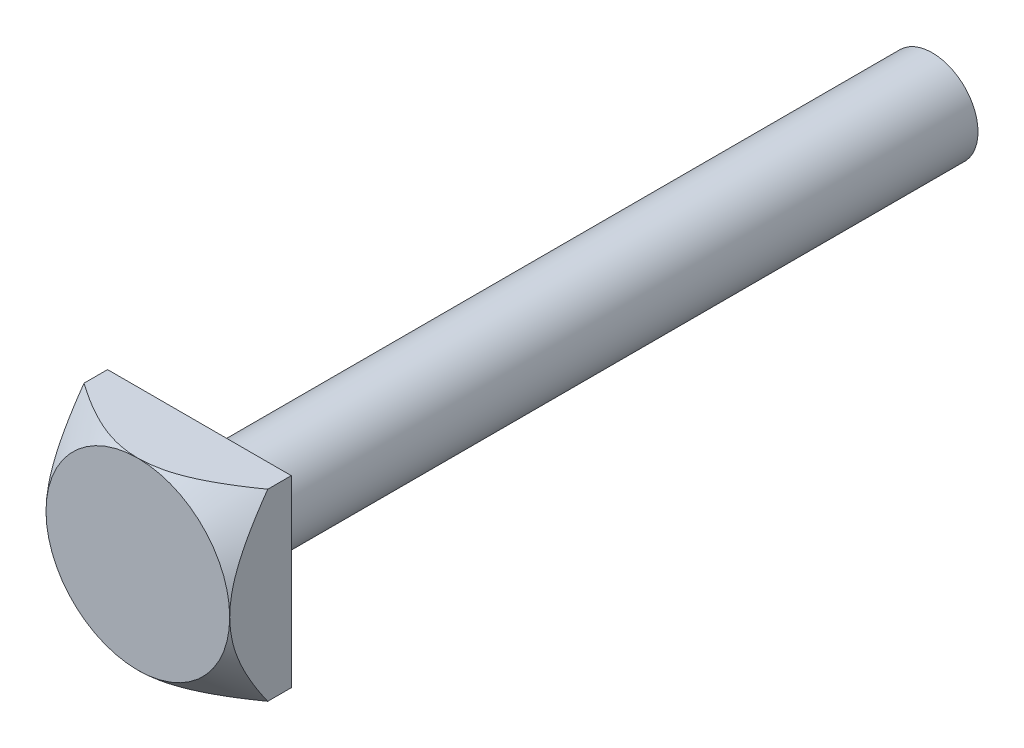
ISO-10303-21;
HEADER;
FILE_DESCRIPTION(('STEP AP214'),'2;1');
FILE_NAME('part.step','',(''),(''),'','','');
FILE_SCHEMA(('AUTOMOTIVE_DESIGN { 1 0 10303 214 1 1 1 1 }'));
ENDSEC;
DATA;
#1=APPLICATION_CONTEXT('core data for automotive mechanical design processes');
#2=APPLICATION_PROTOCOL_DEFINITION('international standard','automotive_design',2000,#1);
#3=PRODUCT_CONTEXT('',#1,'mechanical');
#4=PRODUCT('Part','Part','',(#3));
#5=PRODUCT_RELATED_PRODUCT_CATEGORY('part','',(#4));
#6=PRODUCT_DEFINITION_FORMATION('','',#4);
#7=PRODUCT_DEFINITION_CONTEXT('part definition',#1,'design');
#8=PRODUCT_DEFINITION('design','',#6,#7);
#9=PRODUCT_DEFINITION_SHAPE('','',#8);
#10=(LENGTH_UNIT() NAMED_UNIT(*) SI_UNIT(.MILLI.,.METRE.));
#11=(NAMED_UNIT(*) PLANE_ANGLE_UNIT() SI_UNIT($,.RADIAN.));
#12=(NAMED_UNIT(*) SI_UNIT($,.STERADIAN.) SOLID_ANGLE_UNIT());
#13=UNCERTAINTY_MEASURE_WITH_UNIT(LENGTH_MEASURE(1.E-05),#10,'distance_accuracy_value','');
#14=(GEOMETRIC_REPRESENTATION_CONTEXT(3) GLOBAL_UNCERTAINTY_ASSIGNED_CONTEXT((#13)) GLOBAL_UNIT_ASSIGNED_CONTEXT((#10,
#11,#12)) REPRESENTATION_CONTEXT('',''));
#15=CARTESIAN_POINT('',(0.,0.,0.));
#16=DIRECTION('',(0.,0.,1.));
#17=DIRECTION('',(1.,0.,0.));
#18=AXIS2_PLACEMENT_3D('',#15,#16,#17);
#19=CARTESIAN_POINT('',(9.55,9.55,-6.4));
#20=DIRECTION('',(1.,0.,0.));
#21=DIRECTION('',(0.,0.,-1.));
#22=AXIS2_PLACEMENT_3D('',#19,#20,#21);
#23=PLANE('',#22);
#24=DIRECTION('',(0.,0.,1.));
#25=VECTOR('',#24,1.);
#26=CARTESIAN_POINT('',(9.55,9.55,-6.4));
#27=LINE('',#26,#25);
#28=CARTESIAN_POINT('',(9.55,9.55,-6.4));
#29=VERTEX_POINT('',#28);
#30=CARTESIAN_POINT('',(9.55,9.55,-3.95573952066304));
#31=VERTEX_POINT('',#30);
#32=EDGE_CURVE('E197',#29,#31,#27,.T.);
#33=ORIENTED_EDGE('',*,*,#32,.T.);
#34=CARTESIAN_POINT('',(9.55,29.693933516903,-21.6418609208596));
#35=CARTESIAN_POINT('',(9.55,29.1764652059459,-21.1492594453645));
#36=CARTESIAN_POINT('',(9.55,28.6584091582842,-20.657273895499));
#37=CARTESIAN_POINT('',(9.55,27.6208891459155,-19.6747832589286));
#38=CARTESIAN_POINT('',(9.55,27.1014251723575,-19.184278181572));
#39=CARTESIAN_POINT('',(9.55,26.0606659594791,-18.2048175232453));
#40=CARTESIAN_POINT('',(9.55,25.5393701000784,-17.7158626008558));
#41=CARTESIAN_POINT('',(9.55,24.4948461233191,-16.7400221653327));
#42=CARTESIAN_POINT('',(9.55,23.9716180097625,-16.2531366481311));
#43=CARTESIAN_POINT('',(9.55,22.9169648331294,-15.2763922427827));
#44=CARTESIAN_POINT('',(9.55,22.3855137393102,-14.7865614449679));
#45=CARTESIAN_POINT('',(9.55,21.3197711379315,-13.8099995023414));
#46=CARTESIAN_POINT('',(9.55,20.7854796367506,-13.3232683505744));
#47=CARTESIAN_POINT('',(9.55,19.7135665079601,-12.353765256381));
#48=CARTESIAN_POINT('',(9.55,19.1759457839259,-11.8709923157949));
#49=CARTESIAN_POINT('',(9.55,18.0964206731338,-10.9102600688774));
#50=CARTESIAN_POINT('',(9.55,17.5545163221987,-10.4323007223671));
#51=CARTESIAN_POINT('',(9.55,16.6097636496984,-9.60850871811011));
#52=CARTESIAN_POINT('',(9.55,16.2081549653106,-9.26125520341849));
#53=CARTESIAN_POINT('',(9.55,15.4014597404489,-8.57081408393836));
#54=CARTESIAN_POINT('',(9.55,14.9963732348358,-8.22762643847658));
#55=CARTESIAN_POINT('',(9.55,14.1817270482036,-7.54602459020928));
#56=CARTESIAN_POINT('',(9.55,13.7721645051468,-7.20761380217907));
#57=CARTESIAN_POINT('',(9.55,12.9479334714,-6.53707581236166));
#58=CARTESIAN_POINT('',(9.55,12.5332651073607,-6.20494845522929));
#59=CARTESIAN_POINT('',(9.55,11.6985598258369,-5.54940844216005));
#60=CARTESIAN_POINT('',(9.55,11.2785368448964,-5.2259781018549));
#61=CARTESIAN_POINT('',(9.55,10.4306625755023,-4.58940430025183));
#62=CARTESIAN_POINT('',(9.55,10.0028103357711,-4.27626210208894));
#63=CARTESIAN_POINT('',(9.55,9.13783115554924,-3.66397009190129));
#64=CARTESIAN_POINT('',(9.55,8.70071503391426,-3.36480513833686));
#65=CARTESIAN_POINT('',(9.55,8.03597104038228,-2.9300407641074));
#66=CARTESIAN_POINT('',(9.55,7.81290258742787,-2.78746441862855));
#67=CARTESIAN_POINT('',(9.55,7.36335861643196,-2.50779955071699));
#68=CARTESIAN_POINT('',(9.55,7.13688332441567,-2.37071066641102));
#69=CARTESIAN_POINT('',(9.55,6.73809475908612,-2.13697452151889));
#70=CARTESIAN_POINT('',(9.55,6.56662285651103,-2.03889339866205));
#71=CARTESIAN_POINT('',(9.55,6.22140236384468,-1.84683236833783));
#72=CARTESIAN_POINT('',(9.55,6.04765378061369,-1.75285244851608));
#73=CARTESIAN_POINT('',(9.55,5.52265266088263,-1.47783524093098));
#74=CARTESIAN_POINT('',(9.55,5.16769336730424,-1.30374935938001));
#75=CARTESIAN_POINT('',(9.55,4.44801939046082,-0.980168207494644));
#76=CARTESIAN_POINT('',(9.55,4.08334027206714,-0.830594641441941));
#77=CARTESIAN_POINT('',(9.55,3.34276937216537,-0.562260312048987));
#78=CARTESIAN_POINT('',(9.55,2.96688354418923,-0.443483502134283));
#79=CARTESIAN_POINT('',(9.55,2.30963833658963,-0.271699860119243));
#80=CARTESIAN_POINT('',(9.55,2.03066435154689,-0.209588983086116));
#81=CARTESIAN_POINT('',(9.55,1.46855787870733,-0.108303698297078));
#82=CARTESIAN_POINT('',(9.55,1.18542608380549,-0.0691255123137094));
#83=CARTESIAN_POINT('',(9.55,0.617321995943938,-0.0157617749065207));
#84=CARTESIAN_POINT('',(9.55,0.332354174170014,-0.00152928732844366));
#85=CARTESIAN_POINT('',(9.55,-0.23771847170053,0.00129484069400304));
#86=CARTESIAN_POINT('',(9.55,-0.522823298855705,-0.0101141206771392));
#87=CARTESIAN_POINT('',(9.55,-1.09007005805814,-0.057865025580449));
#88=CARTESIAN_POINT('',(9.55,-1.37221818459153,-0.0941345709152556));
#89=CARTESIAN_POINT('',(9.55,-1.93256124003416,-0.189661936364987));
#90=CARTESIAN_POINT('',(9.55,-2.21075585194957,-0.248921589172384));
#91=CARTESIAN_POINT('',(9.55,-2.76273693122464,-0.38798874577813));
#92=CARTESIAN_POINT('',(9.55,-3.03650866966306,-0.467854012668833));
#93=CARTESIAN_POINT('',(9.55,-3.57822754307582,-0.64513030777742));
#94=CARTESIAN_POINT('',(9.55,-3.84617495809548,-0.742540490299408));
#95=CARTESIAN_POINT('',(9.55,-4.4770897560131,-0.992000236476463));
#96=CARTESIAN_POINT('',(9.55,-4.83740434594086,-1.150734436302));
#97=CARTESIAN_POINT('',(9.55,-5.54769800146413,-1.49001878624924));
#98=CARTESIAN_POINT('',(9.55,-5.8976710318953,-1.67058137393872));
#99=CARTESIAN_POINT('',(9.55,-6.58908584017521,-2.04890803548533));
#100=CARTESIAN_POINT('',(9.55,-6.93050795637214,-2.24670776903849));
#101=CARTESIAN_POINT('',(9.55,-7.60530010201944,-2.65536955539214));
#102=CARTESIAN_POINT('',(9.55,-7.93867162572103,-2.86622915787577));
#103=CARTESIAN_POINT('',(9.55,-8.60297315768565,-3.30106199288578));
#104=CARTESIAN_POINT('',(9.55,-8.9338140039917,-3.5251708067635));
#105=CARTESIAN_POINT('',(9.55,-9.58965852614634,-3.98176502906057));
#106=CARTESIAN_POINT('',(9.55,-9.91466199621162,-4.2142507319228));
#107=CARTESIAN_POINT('',(9.55,-10.5593261690057,-4.68564554047618));
#108=CARTESIAN_POINT('',(9.55,-10.8789931636697,-4.92454606558313));
#109=CARTESIAN_POINT('',(9.55,-11.5141571994954,-5.40780319816399));
#110=CARTESIAN_POINT('',(9.55,-11.8296543144106,-5.65215970893086));
#111=CARTESIAN_POINT('',(9.55,-12.5419636094729,-6.21206127184567));
#112=CARTESIAN_POINT('',(9.55,-12.9376903036899,-6.52898578583347));
#113=CARTESIAN_POINT('',(9.55,-13.724472938816,-7.16858956311645));
#114=CARTESIAN_POINT('',(9.55,-14.1155287367368,-7.4912690018348));
#115=CARTESIAN_POINT('',(9.55,-14.8938019571623,-8.14129881729552));
#116=CARTESIAN_POINT('',(9.55,-15.2810189785957,-8.46864967356554));
#117=CARTESIAN_POINT('',(9.55,-16.0522148536554,-9.12714766599574));
#118=CARTESIAN_POINT('',(9.55,-16.4361936704089,-9.45829484528265));
#119=CARTESIAN_POINT('',(9.55,-17.201799649334,-10.1240602347691));
#120=CARTESIAN_POINT('',(9.55,-17.583424088608,-10.4586815733742));
#121=CARTESIAN_POINT('',(9.55,-18.3443447774176,-11.1305624069584));
#122=CARTESIAN_POINT('',(9.55,-18.7236410149389,-11.4678219155308));
#123=CARTESIAN_POINT('',(9.55,-19.8585035528912,-12.4828785598069));
#124=CARTESIAN_POINT('',(9.55,-20.6110966889252,-13.1640001215344));
#125=CARTESIAN_POINT('',(9.55,-22.0635693241208,-14.4900018900595));
#126=CARTESIAN_POINT('',(9.55,-22.7638071108822,-15.1344906924876));
#127=CARTESIAN_POINT('',(9.55,-24.1602268106212,-16.4278716631752));
#128=CARTESIAN_POINT('',(9.55,-24.8564086456588,-17.076763915537));
#129=CARTESIAN_POINT('',(9.55,-26.2442999872694,-18.3768099647415));
#130=CARTESIAN_POINT('',(9.55,-26.9360152933752,-19.0279575767548));
#131=CARTESIAN_POINT('',(9.55,-28.3168032181963,-20.3330033576064));
#132=CARTESIAN_POINT('',(9.55,-29.0058759247212,-20.9869014335102));
#133=CARTESIAN_POINT('',(9.55,-29.693933516903,-21.6418609208596));
#134=B_SPLINE_CURVE_WITH_KNOTS('',3,(#34,#35,#36,#37,#38,#39,#40,#41,#42,#43,#44,#45,#46,#47,
#48,#49,#50,#51,#52,#53,#54,#55,#56,#57,#58,#59,#60,#61,#62,#63,#64,#65,#66,#67,#68,#69,#70,#71,
#72,#73,#74,#75,#76,#77,#78,#79,#80,#81,#82,#83,#84,#85,#86,#87,#88,#89,#90,#91,#92,#93,#94,#95,
#96,#97,#98,#99,#100,#101,#102,#103,#104,#105,#106,#107,#108,#109,#110,#111,#112,#113,#114,#115,
#116,#117,#118,#119,#120,#121,#122,#123,#124,#125,#126,#127,#128,#129,#130,#131,#132,#133),
.UNSPECIFIED.,.F.,.F.,(4,2,2,2,2,2,2,2,2,2,2,2,2,2,2,2,2,2,2,2,2,2,2,2,2,2,2,2,2,2,2,2,2,2,2,2,
2,2,2,2,2,2,2,2,2,2,2,2,2,4),(0.,2.14333183250438,4.28667717060929,6.43083580142928,
8.57499021546774,10.7432446759854,12.911494269429,15.0791791418796,17.2468459056792,
18.8395802520007,20.4322986517901,22.0261031830036,23.619868258983,25.2101007695557,
26.8005277980995,28.3891899533633,29.1833499822353,29.9774575532737,30.5700283036289,
31.1625972688127,32.3479046066284,33.5293488309213,34.7101762238716,35.5667629100355,
36.4232084313045,37.2780407852267,38.1328932026307,38.9852666642973,39.8377080882178,
40.6925656023141,41.5473819217915,42.7275688366482,43.9084314064603,45.091797697039,
46.2749426308933,47.4735833984073,48.672266338641,49.869418769571,51.0665499978579,
52.5874544245123,54.1084052912917,55.6295134252481,57.1506388563454,58.6732791996949,
60.1959273937673,63.2410126328629,66.0960382879751,68.9511186260953,71.8010525947044,
74.6508910290299),.UNSPECIFIED.);
#135=CARTESIAN_POINT('',(9.55,0.,0.));
#136=VERTEX_POINT('',#135);
#137=EDGE_CURVE('E85',#31,#136,#134,.T.);
#138=ORIENTED_EDGE('',*,*,#137,.T.);
#139=CARTESIAN_POINT('',(9.55,-9.55,-3.95573952066304));
#140=VERTEX_POINT('',#139);
#141=EDGE_CURVE('E171',#136,#140,#134,.T.);
#142=ORIENTED_EDGE('',*,*,#141,.T.);
#143=DIRECTION('',(0.,0.,1.));
#144=VECTOR('',#143,1.);
#145=CARTESIAN_POINT('',(9.55,-9.55,-6.4));
#146=LINE('',#145,#144);
#147=CARTESIAN_POINT('',(9.55,-9.55,-6.4));
#148=VERTEX_POINT('',#147);
#149=EDGE_CURVE('E210',#148,#140,#146,.T.);
#150=ORIENTED_EDGE('',*,*,#149,.F.);
#151=DIRECTION('',(0.,1.,0.));
#152=VECTOR('',#151,1.);
#153=CARTESIAN_POINT('',(9.55,9.55,-6.4));
#154=LINE('',#153,#152);
#155=EDGE_CURVE('E200',#148,#29,#154,.T.);
#156=ORIENTED_EDGE('',*,*,#155,.T.);
#157=EDGE_LOOP('',(#33,#138,#142,#150,#156));
#158=FACE_BOUND('',#157,.T.);
#159=ADVANCED_FACE('F65',(#158),#23,.T.);
#160=CARTESIAN_POINT('',(-9.55,-9.55,-6.4));
#161=DIRECTION('',(0.,-1.,0.));
#162=DIRECTION('',(0.,0.,-1.));
#163=AXIS2_PLACEMENT_3D('',#160,#161,#162);
#164=PLANE('',#163);
#165=ORIENTED_EDGE('',*,*,#149,.T.);
#166=CARTESIAN_POINT('',(29.693933516903,-9.55,-21.6418609208596));
#167=CARTESIAN_POINT('',(29.1764652059459,-9.55,-21.1492594453645));
#168=CARTESIAN_POINT('',(28.6584091582842,-9.55,-20.657273895499));
#169=CARTESIAN_POINT('',(27.6208891459155,-9.55,-19.6747832589286));
#170=CARTESIAN_POINT('',(27.1014251723575,-9.55,-19.184278181572));
#171=CARTESIAN_POINT('',(26.0606659594791,-9.55,-18.2048175232453));
#172=CARTESIAN_POINT('',(25.5393701000784,-9.55,-17.7158626008558));
#173=CARTESIAN_POINT('',(24.4948461233191,-9.55,-16.7400221653327));
#174=CARTESIAN_POINT('',(23.9716180097625,-9.55,-16.2531366481311));
#175=CARTESIAN_POINT('',(22.9169648331294,-9.55,-15.2763922427827));
#176=CARTESIAN_POINT('',(22.3855137393102,-9.55,-14.7865614449679));
#177=CARTESIAN_POINT('',(21.3197711379315,-9.55,-13.8099995023414));
#178=CARTESIAN_POINT('',(20.7854796367505,-9.55,-13.3232683505744));
#179=CARTESIAN_POINT('',(19.7135665079601,-9.55,-12.353765256381));
#180=CARTESIAN_POINT('',(19.1759457839259,-9.55,-11.8709923157949));
#181=CARTESIAN_POINT('',(18.0964206731338,-9.55,-10.9102600688774));
#182=CARTESIAN_POINT('',(17.5545163221987,-9.55,-10.4323007223671));
#183=CARTESIAN_POINT('',(16.6097636496984,-9.55,-9.6085087181101));
#184=CARTESIAN_POINT('',(16.2081549653106,-9.55,-9.26125520341849));
#185=CARTESIAN_POINT('',(15.4014597404489,-9.55,-8.57081408393836));
#186=CARTESIAN_POINT('',(14.9963732348358,-9.55,-8.22762643847657));
#187=CARTESIAN_POINT('',(14.1817270482036,-9.55,-7.54602459020928));
#188=CARTESIAN_POINT('',(13.7721645051468,-9.55,-7.20761380217908));
#189=CARTESIAN_POINT('',(12.9479334714,-9.55,-6.53707581236167));
#190=CARTESIAN_POINT('',(12.5332651073607,-9.55,-6.2049484552293));
#191=CARTESIAN_POINT('',(11.6985598258369,-9.55,-5.54940844216006));
#192=CARTESIAN_POINT('',(11.2785368448964,-9.55,-5.22597810185491));
#193=CARTESIAN_POINT('',(10.4306625755024,-9.55,-4.58940430025184));
#194=CARTESIAN_POINT('',(10.0028103357711,-9.55,-4.27626210208896));
#195=CARTESIAN_POINT('',(9.13783115554927,-9.55,-3.6639700919013));
#196=CARTESIAN_POINT('',(8.70071503391429,-9.55,-3.36480513833688));
#197=CARTESIAN_POINT('',(8.03597104038232,-9.55,-2.93004076410742));
#198=CARTESIAN_POINT('',(7.81290258742791,-9.55,-2.78746441862857));
#199=CARTESIAN_POINT('',(7.36335861643199,-9.55,-2.50779955071701));
#200=CARTESIAN_POINT('',(7.13688332441571,-9.55,-2.37071066641104));
#201=CARTESIAN_POINT('',(6.73809475908616,-9.55,-2.13697452151891));
#202=CARTESIAN_POINT('',(6.56662285651107,-9.55,-2.03889339866207));
#203=CARTESIAN_POINT('',(6.22140236384472,-9.55,-1.84683236833785));
#204=CARTESIAN_POINT('',(6.04765378061374,-9.55,-1.7528524485161));
#205=CARTESIAN_POINT('',(5.52265266088268,-9.55,-1.477835240931));
#206=CARTESIAN_POINT('',(5.16769336730429,-9.55,-1.30374935938003));
#207=CARTESIAN_POINT('',(4.44801939046086,-9.55,-0.980168207494664));
#208=CARTESIAN_POINT('',(4.08334027206719,-9.55,-0.830594641441959));
#209=CARTESIAN_POINT('',(3.34276937216542,-9.55,-0.562260312049002));
#210=CARTESIAN_POINT('',(2.96688354418929,-9.55,-0.443483502134297));
#211=CARTESIAN_POINT('',(2.30963833658968,-9.55,-0.271699860119254));
#212=CARTESIAN_POINT('',(2.03066435154694,-9.55,-0.209588983086126));
#213=CARTESIAN_POINT('',(1.46855787870738,-9.55,-0.108303698297085));
#214=CARTESIAN_POINT('',(1.18542608380555,-9.55,-0.0691255123137147));
#215=CARTESIAN_POINT('',(0.617321995943996,-9.55,-0.0157617749065223));
#216=CARTESIAN_POINT('',(0.332354174170072,-9.55,-0.00152928732844362));
#217=CARTESIAN_POINT('',(-0.237718471700474,-9.55,0.00129484069400648));
#218=CARTESIAN_POINT('',(-0.52282329885565,-9.55,-0.010114120677134));
#219=CARTESIAN_POINT('',(-1.09007005805809,-9.55,-0.0578650255804405));
#220=CARTESIAN_POINT('',(-1.37221818459148,-9.55,-0.0941345709152458));
#221=CARTESIAN_POINT('',(-1.93256124003412,-9.55,-0.189661936364975));
#222=CARTESIAN_POINT('',(-2.21075585194952,-9.55,-0.248921589172371));
#223=CARTESIAN_POINT('',(-2.76273693122459,-9.55,-0.387988745778115));
#224=CARTESIAN_POINT('',(-3.03650866966301,-9.55,-0.467854012668817));
#225=CARTESIAN_POINT('',(-3.57822754307577,-9.55,-0.645130307777401));
#226=CARTESIAN_POINT('',(-3.84617495809543,-9.55,-0.742540490299389));
#227=CARTESIAN_POINT('',(-4.47708975601305,-9.55,-0.992000236476439));
#228=CARTESIAN_POINT('',(-4.8374043459408,-9.55,-1.15073443630197));
#229=CARTESIAN_POINT('',(-5.54769800146406,-9.55,-1.49001878624921));
#230=CARTESIAN_POINT('',(-5.89767103189523,-9.55,-1.67058137393868));
#231=CARTESIAN_POINT('',(-6.58908584017513,-9.55,-2.04890803548528));
#232=CARTESIAN_POINT('',(-6.93050795637205,-9.55,-2.24670776903844));
#233=CARTESIAN_POINT('',(-7.60530010201934,-9.55,-2.65536955539207));
#234=CARTESIAN_POINT('',(-7.93867162572093,-9.55,-2.8662291578757));
#235=CARTESIAN_POINT('',(-8.60297315768553,-9.55,-3.3010619928857));
#236=CARTESIAN_POINT('',(-8.93381400399158,-9.55,-3.52517080676342));
#237=CARTESIAN_POINT('',(-9.58965852614621,-9.55,-3.98176502906048));
#238=CARTESIAN_POINT('',(-9.91466199621149,-9.55,-4.2142507319227));
#239=CARTESIAN_POINT('',(-10.5593261690056,-9.55,-4.68564554047608));
#240=CARTESIAN_POINT('',(-10.8789931636695,-9.55,-4.92454606558302));
#241=CARTESIAN_POINT('',(-11.5141571994953,-9.55,-5.40780319816387));
#242=CARTESIAN_POINT('',(-11.8296543144104,-9.55,-5.65215970893073));
#243=CARTESIAN_POINT('',(-12.5419636094728,-9.55,-6.21206127184554));
#244=CARTESIAN_POINT('',(-12.9376903036898,-9.55,-6.52898578583335));
#245=CARTESIAN_POINT('',(-13.7244729388158,-9.55,-7.16858956311633));
#246=CARTESIAN_POINT('',(-14.1155287367366,-9.55,-7.49126900183469));
#247=CARTESIAN_POINT('',(-14.8938019571621,-9.55,-8.14129881729541));
#248=CARTESIAN_POINT('',(-15.2810189785956,-9.55,-8.46864967356543));
#249=CARTESIAN_POINT('',(-16.0522148536552,-9.55,-9.12714766599564));
#250=CARTESIAN_POINT('',(-16.4361936704088,-9.55,-9.45829484528255));
#251=CARTESIAN_POINT('',(-17.2017996493339,-9.55,-10.124060234769));
#252=CARTESIAN_POINT('',(-17.5834240886079,-9.55,-10.4586815733742));
#253=CARTESIAN_POINT('',(-18.3443447774175,-9.55,-11.1305624069583));
#254=CARTESIAN_POINT('',(-18.7236410149388,-9.55,-11.4678219155307));
#255=CARTESIAN_POINT('',(-19.8585035528911,-9.55,-12.4828785598068));
#256=CARTESIAN_POINT('',(-20.6110966889251,-9.55,-13.1640001215343));
#257=CARTESIAN_POINT('',(-22.0635693241208,-9.55,-14.4900018900595));
#258=CARTESIAN_POINT('',(-22.7638071108821,-9.55,-15.1344906924875));
#259=CARTESIAN_POINT('',(-24.1602268106211,-9.55,-16.4278716631751));
#260=CARTESIAN_POINT('',(-24.8564086456587,-9.55,-17.076763915537));
#261=CARTESIAN_POINT('',(-26.2442999872693,-9.55,-18.3768099647415));
#262=CARTESIAN_POINT('',(-26.9360152933752,-9.55,-19.0279575767547));
#263=CARTESIAN_POINT('',(-28.3168032181963,-9.55,-20.3330033576064));
#264=CARTESIAN_POINT('',(-29.0058759247212,-9.55,-20.9869014335101));
#265=CARTESIAN_POINT('',(-29.693933516903,-9.55,-21.6418609208596));
#266=B_SPLINE_CURVE_WITH_KNOTS('',3,(#166,#167,#168,#169,#170,#171,#172,#173,#174,#175,#176,
#177,#178,#179,#180,#181,#182,#183,#184,#185,#186,#187,#188,#189,#190,#191,#192,#193,#194,#195,
#196,#197,#198,#199,#200,#201,#202,#203,#204,#205,#206,#207,#208,#209,#210,#211,#212,#213,#214,
#215,#216,#217,#218,#219,#220,#221,#222,#223,#224,#225,#226,#227,#228,#229,#230,#231,#232,#233,
#234,#235,#236,#237,#238,#239,#240,#241,#242,#243,#244,#245,#246,#247,#248,#249,#250,#251,#252,
#253,#254,#255,#256,#257,#258,#259,#260,#261,#262,#263,#264,#265),.UNSPECIFIED.,.F.,.F.,(4,2,2,
2,2,2,2,2,2,2,2,2,2,2,2,2,2,2,2,2,2,2,2,2,2,2,2,2,2,2,2,2,2,2,2,2,2,2,2,2,2,2,2,2,2,2,2,2,2,4),
(0.,2.14333183250438,4.28667717060929,6.43083580142928,8.57499021546775,10.7432446759854,
12.911494269429,15.0791791418797,17.2468459056792,18.8395802520007,20.4322986517901,
22.0261031830036,23.6198682589829,25.2101007695557,26.8005277980994,28.3891899533633,
29.1833499822353,29.9774575532736,30.5700283036288,31.1625972688127,32.3479046066283,
33.5293488309213,34.7101762238716,35.5667629100355,36.4232084313044,37.2780407852266,
38.1328932026306,38.9852666642973,39.8377080882178,40.692565602314,41.5473819217915,
42.7275688366481,43.9084314064602,45.0917976970389,46.2749426308931,47.4735833984071,
48.6722663386408,49.8694187695708,51.0665499978576,52.5874544245121,54.1084052912915,
55.6295134252479,57.1506388563452,58.6732791996947,60.1959273937672,63.2410126328628,
66.0960382879751,68.9511186260952,71.8010525947044,74.6508910290299),.UNSPECIFIED.);
#267=CARTESIAN_POINT('',(0.,-9.55,0.));
#268=VERTEX_POINT('',#267);
#269=EDGE_CURVE('E170',#140,#268,#266,.T.);
#270=ORIENTED_EDGE('',*,*,#269,.T.);
#271=CARTESIAN_POINT('',(-9.55,-9.55,-3.95573952066304));
#272=VERTEX_POINT('',#271);
#273=EDGE_CURVE('E163',#268,#272,#266,.T.);
#274=ORIENTED_EDGE('',*,*,#273,.T.);
#275=DIRECTION('',(0.,0.,1.));
#276=VECTOR('',#275,1.);
#277=CARTESIAN_POINT('',(-9.55,-9.55,-6.4));
#278=LINE('',#277,#276);
#279=CARTESIAN_POINT('',(-9.55,-9.55,-6.4));
#280=VERTEX_POINT('',#279);
#281=EDGE_CURVE('E203',#280,#272,#278,.T.);
#282=ORIENTED_EDGE('',*,*,#281,.F.);
#283=DIRECTION('',(1.,0.,0.));
#284=VECTOR('',#283,1.);
#285=CARTESIAN_POINT('',(-9.55,-9.55,-6.4));
#286=LINE('',#285,#284);
#287=EDGE_CURVE('E202',#280,#148,#286,.T.);
#288=ORIENTED_EDGE('',*,*,#287,.T.);
#289=EDGE_LOOP('',(#165,#270,#274,#282,#288));
#290=FACE_BOUND('',#289,.T.);
#291=ADVANCED_FACE('F177',(#290),#164,.T.);
#292=CARTESIAN_POINT('',(-9.55,9.55,-6.4));
#293=DIRECTION('',(-1.,0.,0.));
#294=DIRECTION('',(0.,-1.,0.));
#295=AXIS2_PLACEMENT_3D('',#292,#293,#294);
#296=PLANE('',#295);
#297=ORIENTED_EDGE('',*,*,#281,.T.);
#298=CARTESIAN_POINT('',(-9.55,-29.693933516903,-21.6418609208596));
#299=CARTESIAN_POINT('',(-9.55,-29.1764652059459,-21.1492594453645));
#300=CARTESIAN_POINT('',(-9.55,-28.6584091582842,-20.657273895499));
#301=CARTESIAN_POINT('',(-9.55,-27.6208891459155,-19.6747832589286));
#302=CARTESIAN_POINT('',(-9.55,-27.1014251723575,-19.184278181572));
#303=CARTESIAN_POINT('',(-9.55,-26.0606659594791,-18.2048175232453));
#304=CARTESIAN_POINT('',(-9.55,-25.5393701000784,-17.7158626008558));
#305=CARTESIAN_POINT('',(-9.55,-24.4948461233191,-16.7400221653327));
#306=CARTESIAN_POINT('',(-9.55,-23.9716180097625,-16.2531366481311));
#307=CARTESIAN_POINT('',(-9.55,-22.9169648331294,-15.2763922427827));
#308=CARTESIAN_POINT('',(-9.55,-22.3855137393102,-14.7865614449679));
#309=CARTESIAN_POINT('',(-9.55,-21.3197711379315,-13.8099995023414));
#310=CARTESIAN_POINT('',(-9.55,-20.7854796367506,-13.3232683505744));
#311=CARTESIAN_POINT('',(-9.55,-19.7135665079601,-12.353765256381));
#312=CARTESIAN_POINT('',(-9.55,-19.1759457839259,-11.8709923157949));
#313=CARTESIAN_POINT('',(-9.55,-18.0964206731338,-10.9102600688774));
#314=CARTESIAN_POINT('',(-9.55,-17.5545163221987,-10.4323007223671));
#315=CARTESIAN_POINT('',(-9.55,-16.6097636496984,-9.60850871811011));
#316=CARTESIAN_POINT('',(-9.55,-16.2081549653106,-9.26125520341849));
#317=CARTESIAN_POINT('',(-9.55,-15.4014597404489,-8.57081408393836));
#318=CARTESIAN_POINT('',(-9.55,-14.9963732348358,-8.22762643847657));
#319=CARTESIAN_POINT('',(-9.55,-14.1817270482036,-7.54602459020928));
#320=CARTESIAN_POINT('',(-9.55,-13.7721645051468,-7.20761380217908));
#321=CARTESIAN_POINT('',(-9.55,-12.9479334714,-6.53707581236167));
#322=CARTESIAN_POINT('',(-9.55,-12.5332651073607,-6.20494845522929));
#323=CARTESIAN_POINT('',(-9.55,-11.6985598258369,-5.54940844216006));
#324=CARTESIAN_POINT('',(-9.55,-11.2785368448964,-5.22597810185491));
#325=CARTESIAN_POINT('',(-9.55,-10.4306625755024,-4.58940430025184));
#326=CARTESIAN_POINT('',(-9.55,-10.0028103357711,-4.27626210208895));
#327=CARTESIAN_POINT('',(-9.55,-9.13783115554926,-3.6639700919013));
#328=CARTESIAN_POINT('',(-9.55,-8.70071503391428,-3.36480513833688));
#329=CARTESIAN_POINT('',(-9.55,-8.03597104038231,-2.93004076410741));
#330=CARTESIAN_POINT('',(-9.55,-7.8129025874279,-2.78746441862857));
#331=CARTESIAN_POINT('',(-9.55,-7.36335861643198,-2.50779955071701));
#332=CARTESIAN_POINT('',(-9.55,-7.1368833244157,-2.37071066641104));
#333=CARTESIAN_POINT('',(-9.55,-6.73809475908615,-2.1369745215189));
#334=CARTESIAN_POINT('',(-9.55,-6.56662285651106,-2.03889339866206));
#335=CARTESIAN_POINT('',(-9.55,-6.22140236384471,-1.84683236833785));
#336=CARTESIAN_POINT('',(-9.55,-6.04765378061372,-1.7528524485161));
#337=CARTESIAN_POINT('',(-9.55,-5.52265266088266,-1.477835240931));
#338=CARTESIAN_POINT('',(-9.55,-5.16769336730427,-1.30374935938002));
#339=CARTESIAN_POINT('',(-9.55,-4.44801939046085,-0.980168207494656));
#340=CARTESIAN_POINT('',(-9.55,-4.08334027206717,-0.830594641441951));
#341=CARTESIAN_POINT('',(-9.55,-3.3427693721654,-0.562260312048995));
#342=CARTESIAN_POINT('',(-9.55,-2.96688354418927,-0.443483502134292));
#343=CARTESIAN_POINT('',(-9.55,-2.30963833658966,-0.271699860119249));
#344=CARTESIAN_POINT('',(-9.55,-2.03066435154692,-0.209588983086121));
#345=CARTESIAN_POINT('',(-9.55,-1.46855787870736,-0.108303698297081));
#346=CARTESIAN_POINT('',(-9.55,-1.18542608380553,-0.0691255123137127));
#347=CARTESIAN_POINT('',(-9.55,-0.617321995943971,-0.0157617749065225));
#348=CARTESIAN_POINT('',(-9.55,-0.332354174170048,-0.00152928732844402));
#349=CARTESIAN_POINT('',(-9.55,0.237718471700497,0.00129484069400515));
#350=CARTESIAN_POINT('',(-9.55,0.522823298855672,-0.0101141206771361));
#351=CARTESIAN_POINT('',(-9.55,1.09007005805811,-0.0578650255804438));
#352=CARTESIAN_POINT('',(-9.55,1.37221818459151,-0.0941345709152496));
#353=CARTESIAN_POINT('',(-9.55,1.93256124003414,-0.18966193636498));
#354=CARTESIAN_POINT('',(-9.55,2.21075585194953,-0.248921589172377));
#355=CARTESIAN_POINT('',(-9.55,2.76273693122461,-0.387988745778122));
#356=CARTESIAN_POINT('',(-9.55,3.03650866966303,-0.467854012668823));
#357=CARTESIAN_POINT('',(-9.55,3.57822754307579,-0.645130307777408));
#358=CARTESIAN_POINT('',(-9.55,3.84617495809545,-0.742540490299396));
#359=CARTESIAN_POINT('',(-9.55,4.47708975601307,-0.992000236476449));
#360=CARTESIAN_POINT('',(-9.55,4.83740434594082,-1.15073443630199));
#361=CARTESIAN_POINT('',(-9.55,5.54769800146409,-1.49001878624922));
#362=CARTESIAN_POINT('',(-9.55,5.89767103189526,-1.6705813739387));
#363=CARTESIAN_POINT('',(-9.55,6.58908584017516,-2.0489080354853));
#364=CARTESIAN_POINT('',(-9.55,6.93050795637209,-2.24670776903846));
#365=CARTESIAN_POINT('',(-9.55,7.60530010201938,-2.6553695553921));
#366=CARTESIAN_POINT('',(-9.55,7.93867162572096,-2.86622915787572));
#367=CARTESIAN_POINT('',(-9.55,8.60297315768558,-3.30106199288573));
#368=CARTESIAN_POINT('',(-9.55,8.93381400399163,-3.52517080676345));
#369=CARTESIAN_POINT('',(-9.55,9.58965852614626,-3.98176502906052));
#370=CARTESIAN_POINT('',(-9.55,9.91466199621154,-4.21425073192274));
#371=CARTESIAN_POINT('',(-9.55,10.5593261690056,-4.68564554047612));
#372=CARTESIAN_POINT('',(-9.55,10.8789931636696,-4.92454606558307));
#373=CARTESIAN_POINT('',(-9.55,11.5141571994954,-5.40780319816392));
#374=CARTESIAN_POINT('',(-9.55,11.8296543144105,-5.65215970893078));
#375=CARTESIAN_POINT('',(-9.55,12.5419636094728,-6.21206127184559));
#376=CARTESIAN_POINT('',(-9.55,12.9376903036898,-6.5289857858334));
#377=CARTESIAN_POINT('',(-9.55,13.7244729388159,-7.16858956311639));
#378=CARTESIAN_POINT('',(-9.55,14.1155287367367,-7.49126900183473));
#379=CARTESIAN_POINT('',(-9.55,14.8938019571622,-8.14129881729546));
#380=CARTESIAN_POINT('',(-9.55,15.2810189785956,-8.46864967356547));
#381=CARTESIAN_POINT('',(-9.55,16.0522148536553,-9.12714766599568));
#382=CARTESIAN_POINT('',(-9.55,16.4361936704089,-9.45829484528259));
#383=CARTESIAN_POINT('',(-9.55,17.2017996493339,-10.124060234769));
#384=CARTESIAN_POINT('',(-9.55,17.5834240886079,-10.4586815733742));
#385=CARTESIAN_POINT('',(-9.55,18.3443447774175,-11.1305624069583));
#386=CARTESIAN_POINT('',(-9.55,18.7236410149389,-11.4678219155308));
#387=CARTESIAN_POINT('',(-9.55,19.8585035528912,-12.4828785598069));
#388=CARTESIAN_POINT('',(-9.55,20.6110966889252,-13.1640001215344));
#389=CARTESIAN_POINT('',(-9.55,22.0635693241208,-14.4900018900595));
#390=CARTESIAN_POINT('',(-9.55,22.7638071108822,-15.1344906924876));
#391=CARTESIAN_POINT('',(-9.55,24.1602268106212,-16.4278716631752));
#392=CARTESIAN_POINT('',(-9.55,24.8564086456588,-17.076763915537));
#393=CARTESIAN_POINT('',(-9.55,26.2442999872694,-18.3768099647415));
#394=CARTESIAN_POINT('',(-9.55,26.9360152933752,-19.0279575767548));
#395=CARTESIAN_POINT('',(-9.55,28.3168032181963,-20.3330033576064));
#396=CARTESIAN_POINT('',(-9.55,29.0058759247212,-20.9869014335101));
#397=CARTESIAN_POINT('',(-9.55,29.693933516903,-21.6418609208596));
#398=B_SPLINE_CURVE_WITH_KNOTS('',3,(#298,#299,#300,#301,#302,#303,#304,#305,#306,#307,#308,
#309,#310,#311,#312,#313,#314,#315,#316,#317,#318,#319,#320,#321,#322,#323,#324,#325,#326,#327,
#328,#329,#330,#331,#332,#333,#334,#335,#336,#337,#338,#339,#340,#341,#342,#343,#344,#345,#346,
#347,#348,#349,#350,#351,#352,#353,#354,#355,#356,#357,#358,#359,#360,#361,#362,#363,#364,#365,
#366,#367,#368,#369,#370,#371,#372,#373,#374,#375,#376,#377,#378,#379,#380,#381,#382,#383,#384,
#385,#386,#387,#388,#389,#390,#391,#392,#393,#394,#395,#396,#397),.UNSPECIFIED.,.F.,.F.,(4,2,2,
2,2,2,2,2,2,2,2,2,2,2,2,2,2,2,2,2,2,2,2,2,2,2,2,2,2,2,2,2,2,2,2,2,2,2,2,2,2,2,2,2,2,2,2,2,2,4),
(0.,2.14333183250438,4.28667717060929,6.43083580142928,8.57499021546774,10.7432446759854,
12.911494269429,15.0791791418797,17.2468459056792,18.8395802520007,20.4322986517901,
22.0261031830036,23.6198682589829,25.2101007695557,26.8005277980994,28.3891899533633,
29.1833499822353,29.9774575532737,30.5700283036288,31.1625972688127,32.3479046066283,
33.5293488309213,34.7101762238716,35.5667629100355,36.4232084313044,37.2780407852267,
38.1328932026307,38.9852666642973,39.8377080882178,40.692565602314,41.5473819217915,
42.7275688366482,43.9084314064602,45.0917976970389,46.2749426308932,47.4735833984072,
48.6722663386409,49.8694187695709,51.0665499978577,52.5874544245122,54.1084052912916,
55.629513425248,57.1506388563453,58.6732791996948,60.1959273937673,63.2410126328629,
66.0960382879751,68.9511186260953,71.8010525947044,74.6508910290299),.UNSPECIFIED.);
#399=CARTESIAN_POINT('',(-9.55,0.,0.));
#400=VERTEX_POINT('',#399);
#401=EDGE_CURVE('E139',#272,#400,#398,.T.);
#402=ORIENTED_EDGE('',*,*,#401,.T.);
#403=CARTESIAN_POINT('',(-9.55,9.55,-3.95573952066304));
#404=VERTEX_POINT('',#403);
#405=EDGE_CURVE('E126',#400,#404,#398,.T.);
#406=ORIENTED_EDGE('',*,*,#405,.T.);
#407=DIRECTION('',(0.,0.,1.));
#408=VECTOR('',#407,1.);
#409=CARTESIAN_POINT('',(-9.55,9.55,-6.4));
#410=LINE('',#409,#408);
#411=CARTESIAN_POINT('',(-9.55,9.55,-6.4));
#412=VERTEX_POINT('',#411);
#413=EDGE_CURVE('E138',#412,#404,#410,.T.);
#414=ORIENTED_EDGE('',*,*,#413,.F.);
#415=DIRECTION('',(0.,-1.,0.));
#416=VECTOR('',#415,1.);
#417=CARTESIAN_POINT('',(-9.55,9.55,-6.4));
#418=LINE('',#417,#416);
#419=EDGE_CURVE('E206',#412,#280,#418,.T.);
#420=ORIENTED_EDGE('',*,*,#419,.T.);
#421=EDGE_LOOP('',(#297,#402,#406,#414,#420));
#422=FACE_BOUND('',#421,.T.);
#423=ADVANCED_FACE('F181',(#422),#296,.T.);
#424=CARTESIAN_POINT('',(-9.55,9.55,-6.4));
#425=DIRECTION('',(0.,1.,0.));
#426=DIRECTION('',(0.,0.,1.));
#427=AXIS2_PLACEMENT_3D('',#424,#425,#426);
#428=PLANE('',#427);
#429=ORIENTED_EDGE('',*,*,#413,.T.);
#430=CARTESIAN_POINT('',(-29.693933516903,9.55,-21.6418609208596));
#431=CARTESIAN_POINT('',(-29.1764652059459,9.55,-21.1492594453645));
#432=CARTESIAN_POINT('',(-28.6584091582842,9.55,-20.657273895499));
#433=CARTESIAN_POINT('',(-27.6208891459155,9.55,-19.6747832589286));
#434=CARTESIAN_POINT('',(-27.1014251723575,9.55,-19.184278181572));
#435=CARTESIAN_POINT('',(-26.0606659594791,9.55,-18.2048175232453));
#436=CARTESIAN_POINT('',(-25.5393701000784,9.55,-17.7158626008558));
#437=CARTESIAN_POINT('',(-24.4948461233191,9.55,-16.7400221653327));
#438=CARTESIAN_POINT('',(-23.9716180097625,9.55,-16.2531366481311));
#439=CARTESIAN_POINT('',(-22.9169648331294,9.55,-15.2763922427827));
#440=CARTESIAN_POINT('',(-22.3855137393102,9.55,-14.7865614449679));
#441=CARTESIAN_POINT('',(-21.3197711379315,9.55,-13.8099995023414));
#442=CARTESIAN_POINT('',(-20.7854796367506,9.55,-13.3232683505744));
#443=CARTESIAN_POINT('',(-19.7135665079601,9.55,-12.353765256381));
#444=CARTESIAN_POINT('',(-19.1759457839259,9.55,-11.8709923157949));
#445=CARTESIAN_POINT('',(-18.0964206731338,9.55,-10.9102600688774));
#446=CARTESIAN_POINT('',(-17.5545163221987,9.55,-10.4323007223671));
#447=CARTESIAN_POINT('',(-16.6097636496984,9.55,-9.60850871811011));
#448=CARTESIAN_POINT('',(-16.2081549653106,9.55,-9.2612552034185));
#449=CARTESIAN_POINT('',(-15.4014597404489,9.55,-8.57081408393837));
#450=CARTESIAN_POINT('',(-14.9963732348358,9.55,-8.22762643847658));
#451=CARTESIAN_POINT('',(-14.1817270482036,9.55,-7.54602459020928));
#452=CARTESIAN_POINT('',(-13.7721645051468,9.55,-7.20761380217908));
#453=CARTESIAN_POINT('',(-12.9479334714,9.55,-6.53707581236167));
#454=CARTESIAN_POINT('',(-12.5332651073607,9.55,-6.20494845522929));
#455=CARTESIAN_POINT('',(-11.6985598258369,9.55,-5.54940844216005));
#456=CARTESIAN_POINT('',(-11.2785368448964,9.55,-5.2259781018549));
#457=CARTESIAN_POINT('',(-10.4306625755023,9.55,-4.58940430025184));
#458=CARTESIAN_POINT('',(-10.0028103357711,9.55,-4.27626210208895));
#459=CARTESIAN_POINT('',(-9.13783115554925,9.55,-3.66397009190129));
#460=CARTESIAN_POINT('',(-8.70071503391427,9.55,-3.36480513833687));
#461=CARTESIAN_POINT('',(-8.03597104038229,9.55,-2.93004076410741));
#462=CARTESIAN_POINT('',(-7.81290258742788,9.55,-2.78746441862856));
#463=CARTESIAN_POINT('',(-7.36335861643196,9.55,-2.507799550717));
#464=CARTESIAN_POINT('',(-7.13688332441568,9.55,-2.37071066641103));
#465=CARTESIAN_POINT('',(-6.73809475908613,9.55,-2.1369745215189));
#466=CARTESIAN_POINT('',(-6.56662285651104,9.55,-2.03889339866205));
#467=CARTESIAN_POINT('',(-6.22140236384469,9.55,-1.84683236833784));
#468=CARTESIAN_POINT('',(-6.04765378061371,9.55,-1.75285244851609));
#469=CARTESIAN_POINT('',(-5.52265266088265,9.55,-1.47783524093099));
#470=CARTESIAN_POINT('',(-5.16769336730426,9.55,-1.30374935938002));
#471=CARTESIAN_POINT('',(-4.44801939046083,9.55,-0.980168207494651));
#472=CARTESIAN_POINT('',(-4.08334027206715,9.55,-0.830594641441947));
#473=CARTESIAN_POINT('',(-3.34276937216538,9.55,-0.562260312048992));
#474=CARTESIAN_POINT('',(-2.96688354418924,9.55,-0.443483502134289));
#475=CARTESIAN_POINT('',(-2.30963833658963,9.55,-0.271699860119247));
#476=CARTESIAN_POINT('',(-2.03066435154689,9.55,-0.209588983086118));
#477=CARTESIAN_POINT('',(-1.46855787870733,9.55,-0.108303698297079));
#478=CARTESIAN_POINT('',(-1.1854260838055,9.55,-0.0691255123137111));
#479=CARTESIAN_POINT('',(-0.617321995943943,9.55,-0.0157617749065224));
#480=CARTESIAN_POINT('',(-0.332354174170019,9.55,-0.00152928732844521));
#481=CARTESIAN_POINT('',(0.237718471700525,9.55,0.00129484069400111));
#482=CARTESIAN_POINT('',(0.522823298855698,9.55,-0.0101141206771415));
#483=CARTESIAN_POINT('',(1.09007005805814,9.55,-0.0578650255804505));
#484=CARTESIAN_POINT('',(1.37221818459153,9.55,-0.0941345709152561));
#485=CARTESIAN_POINT('',(1.93256124003416,9.55,-0.189661936364987));
#486=CARTESIAN_POINT('',(2.21075585194956,9.55,-0.248921589172383));
#487=CARTESIAN_POINT('',(2.76273693122463,9.55,-0.38798874577813));
#488=CARTESIAN_POINT('',(3.03650866966305,9.55,-0.467854012668833));
#489=CARTESIAN_POINT('',(3.57822754307581,9.55,-0.645130307777419));
#490=CARTESIAN_POINT('',(3.84617495809547,9.55,-0.742540490299407));
#491=CARTESIAN_POINT('',(4.47708975601309,9.55,-0.992000236476461));
#492=CARTESIAN_POINT('',(4.83740434594085,9.55,-1.150734436302));
#493=CARTESIAN_POINT('',(5.54769800146412,9.55,-1.49001878624924));
#494=CARTESIAN_POINT('',(5.89767103189529,9.55,-1.67058137393872));
#495=CARTESIAN_POINT('',(6.5890858401752,9.55,-2.04890803548532));
#496=CARTESIAN_POINT('',(6.93050795637213,9.55,-2.24670776903849));
#497=CARTESIAN_POINT('',(7.60530010201943,9.55,-2.65536955539213));
#498=CARTESIAN_POINT('',(7.93867162572102,9.55,-2.86622915787576));
#499=CARTESIAN_POINT('',(8.60297315768563,9.55,-3.30106199288577));
#500=CARTESIAN_POINT('',(8.93381400399169,9.55,-3.52517080676349));
#501=CARTESIAN_POINT('',(9.58965852614632,9.55,-3.98176502906056));
#502=CARTESIAN_POINT('',(9.9146619962116,9.55,-4.21425073192279));
#503=CARTESIAN_POINT('',(10.5593261690057,9.55,-4.68564554047617));
#504=CARTESIAN_POINT('',(10.8789931636697,9.55,-4.92454606558312));
#505=CARTESIAN_POINT('',(11.5141571994954,9.55,-5.40780319816398));
#506=CARTESIAN_POINT('',(11.8296543144106,9.55,-5.65215970893084));
#507=CARTESIAN_POINT('',(12.5419636094729,9.55,-6.21206127184565));
#508=CARTESIAN_POINT('',(12.9376903036899,9.55,-6.52898578583345));
#509=CARTESIAN_POINT('',(13.724472938816,9.55,-7.16858956311644));
#510=CARTESIAN_POINT('',(14.1155287367368,9.55,-7.49126900183479));
#511=CARTESIAN_POINT('',(14.8938019571623,9.55,-8.14129881729552));
#512=CARTESIAN_POINT('',(15.2810189785957,9.55,-8.46864967356553));
#513=CARTESIAN_POINT('',(16.0522148536554,9.55,-9.12714766599574));
#514=CARTESIAN_POINT('',(16.4361936704089,9.55,-9.45829484528265));
#515=CARTESIAN_POINT('',(17.201799649334,9.55,-10.1240602347691));
#516=CARTESIAN_POINT('',(17.583424088608,9.55,-10.4586815733742));
#517=CARTESIAN_POINT('',(18.3443447774176,9.55,-11.1305624069584));
#518=CARTESIAN_POINT('',(18.7236410149389,9.55,-11.4678219155308));
#519=CARTESIAN_POINT('',(19.8585035528912,9.55,-12.4828785598069));
#520=CARTESIAN_POINT('',(20.6110966889252,9.55,-13.1640001215344));
#521=CARTESIAN_POINT('',(22.0635693241208,9.55,-14.4900018900596));
#522=CARTESIAN_POINT('',(22.7638071108822,9.55,-15.1344906924876));
#523=CARTESIAN_POINT('',(24.1602268106212,9.55,-16.4278716631752));
#524=CARTESIAN_POINT('',(24.8564086456588,9.55,-17.076763915537));
#525=CARTESIAN_POINT('',(26.2442999872694,9.55,-18.3768099647416));
#526=CARTESIAN_POINT('',(26.9360152933753,9.55,-19.0279575767548));
#527=CARTESIAN_POINT('',(28.3168032181963,9.55,-20.3330033576064));
#528=CARTESIAN_POINT('',(29.0058759247212,9.55,-20.9869014335102));
#529=CARTESIAN_POINT('',(29.693933516903,9.55,-21.6418609208596));
#530=B_SPLINE_CURVE_WITH_KNOTS('',3,(#430,#431,#432,#433,#434,#435,#436,#437,#438,#439,#440,
#441,#442,#443,#444,#445,#446,#447,#448,#449,#450,#451,#452,#453,#454,#455,#456,#457,#458,#459,
#460,#461,#462,#463,#464,#465,#466,#467,#468,#469,#470,#471,#472,#473,#474,#475,#476,#477,#478,
#479,#480,#481,#482,#483,#484,#485,#486,#487,#488,#489,#490,#491,#492,#493,#494,#495,#496,#497,
#498,#499,#500,#501,#502,#503,#504,#505,#506,#507,#508,#509,#510,#511,#512,#513,#514,#515,#516,
#517,#518,#519,#520,#521,#522,#523,#524,#525,#526,#527,#528,#529),.UNSPECIFIED.,.F.,.F.,(4,2,2,
2,2,2,2,2,2,2,2,2,2,2,2,2,2,2,2,2,2,2,2,2,2,2,2,2,2,2,2,2,2,2,2,2,2,2,2,2,2,2,2,2,2,2,2,2,2,4),
(0.,2.14333183250438,4.28667717060929,6.43083580142928,8.57499021546774,10.7432446759854,
12.911494269429,15.0791791418796,17.2468459056792,18.8395802520007,20.4322986517901,
22.0261031830036,23.6198682589829,25.2101007695557,26.8005277980994,28.3891899533633,
29.1833499822353,29.9774575532737,30.5700283036289,31.1625972688127,32.3479046066284,
33.5293488309213,34.7101762238716,35.5667629100355,36.4232084313045,37.2780407852267,
38.1328932026307,38.9852666642973,39.8377080882178,40.692565602314,41.5473819217915,
42.7275688366482,43.9084314064602,45.091797697039,46.2749426308932,47.4735833984072,
48.672266338641,49.869418769571,51.0665499978578,52.5874544245123,54.1084052912917,
55.6295134252481,57.1506388563454,58.6732791996949,60.1959273937673,63.2410126328629,
66.0960382879752,68.9511186260953,71.8010525947044,74.6508910290299),.UNSPECIFIED.);
#531=CARTESIAN_POINT('',(0.,9.55,0.));
#532=VERTEX_POINT('',#531);
#533=EDGE_CURVE('E121',#404,#532,#530,.T.);
#534=ORIENTED_EDGE('',*,*,#533,.T.);
#535=EDGE_CURVE('E115',#532,#31,#530,.T.);
#536=ORIENTED_EDGE('',*,*,#535,.T.);
#537=ORIENTED_EDGE('',*,*,#32,.F.);
#538=DIRECTION('',(-1.,0.,0.));
#539=VECTOR('',#538,1.);
#540=CARTESIAN_POINT('',(-9.55,9.55,-6.4));
#541=LINE('',#540,#539);
#542=EDGE_CURVE('E216',#29,#412,#541,.T.);
#543=ORIENTED_EDGE('',*,*,#542,.T.);
#544=EDGE_LOOP('',(#429,#534,#536,#537,#543));
#545=FACE_BOUND('',#544,.T.);
#546=ADVANCED_FACE('F136',(#545),#428,.T.);
#547=CARTESIAN_POINT('',(0.,0.,-6.4));
#548=DIRECTION('',(0.,0.,1.));
#549=DIRECTION('',(1.,0.,0.));
#550=AXIS2_PLACEMENT_3D('',#547,#548,#549);
#551=PLANE('',#550);
#552=CARTESIAN_POINT('',(0.,0.,-6.4));
#553=DIRECTION('',(0.,0.,-1.));
#554=DIRECTION('',(-1.,0.,0.));
#555=AXIS2_PLACEMENT_3D('',#552,#553,#554);
#556=CIRCLE('',#555,4.75);
#557=CARTESIAN_POINT('',(4.75,0.,-6.4));
#558=VERTEX_POINT('',#557);
#559=EDGE_CURVE('E212',#558,#558,#556,.T.);
#560=ORIENTED_EDGE('',*,*,#559,.F.);
#561=EDGE_LOOP('',(#560));
#562=FACE_BOUND('',#561,.T.);
#563=ORIENTED_EDGE('',*,*,#155,.F.);
#564=ORIENTED_EDGE('',*,*,#287,.F.);
#565=ORIENTED_EDGE('',*,*,#419,.F.);
#566=ORIENTED_EDGE('',*,*,#542,.F.);
#567=EDGE_LOOP('',(#563,#564,#565,#566));
#568=FACE_BOUND('',#567,.T.);
#569=ADVANCED_FACE('F190',(#562,#568),#551,.F.);
#570=CARTESIAN_POINT('',(0.,0.,-82.6));
#571=DIRECTION('',(0.,0.,1.));
#572=DIRECTION('',(1.,0.,0.));
#573=AXIS2_PLACEMENT_3D('',#570,#571,#572);
#574=CYLINDRICAL_SURFACE('',#573,4.75);
#575=CARTESIAN_POINT('',(0.,0.,-82.6));
#576=DIRECTION('',(0.,0.,-1.));
#577=DIRECTION('',(-1.,0.,0.));
#578=AXIS2_PLACEMENT_3D('',#575,#576,#577);
#579=CIRCLE('',#578,4.75);
#580=CARTESIAN_POINT('',(4.75,0.,-82.6));
#581=VERTEX_POINT('',#580);
#582=EDGE_CURVE('E219',#581,#581,#579,.T.);
#583=CARTESIAN_POINT('',(4.75,0.,-82.6));
#584=CARTESIAN_POINT('',(4.75,0.,-81.80625));
#585=CARTESIAN_POINT('',(4.75,0.,-81.0125));
#586=CARTESIAN_POINT('',(4.75,0.,-79.425));
#587=CARTESIAN_POINT('',(4.75,0.,-78.63125));
#588=CARTESIAN_POINT('',(4.75,0.,-77.04375));
#589=CARTESIAN_POINT('',(4.75,0.,-76.25));
#590=CARTESIAN_POINT('',(4.75,0.,-74.6625));
#591=CARTESIAN_POINT('',(4.75,0.,-73.86875));
#592=CARTESIAN_POINT('',(4.75,0.,-72.28125));
#593=CARTESIAN_POINT('',(4.75,0.,-71.4875));
#594=CARTESIAN_POINT('',(4.75,0.,-69.9));
#595=CARTESIAN_POINT('',(4.75,0.,-69.10625));
#596=CARTESIAN_POINT('',(4.75,0.,-67.51875));
#597=CARTESIAN_POINT('',(4.75,0.,-66.725));
#598=CARTESIAN_POINT('',(4.75,0.,-65.1375));
#599=CARTESIAN_POINT('',(4.75,0.,-64.34375));
#600=CARTESIAN_POINT('',(4.75,0.,-62.75625));
#601=CARTESIAN_POINT('',(4.75,0.,-61.9625));
#602=CARTESIAN_POINT('',(4.75,0.,-60.375));
#603=CARTESIAN_POINT('',(4.75,0.,-59.58125));
#604=CARTESIAN_POINT('',(4.75,0.,-57.99375));
#605=CARTESIAN_POINT('',(4.75,0.,-57.2));
#606=CARTESIAN_POINT('',(4.75,0.,-55.6125));
#607=CARTESIAN_POINT('',(4.75,0.,-54.81875));
#608=CARTESIAN_POINT('',(4.75,0.,-53.23125));
#609=CARTESIAN_POINT('',(4.75,0.,-52.4375));
#610=CARTESIAN_POINT('',(4.75,0.,-50.85));
#611=CARTESIAN_POINT('',(4.75,0.,-50.05625));
#612=CARTESIAN_POINT('',(4.75,0.,-48.46875));
#613=CARTESIAN_POINT('',(4.75,0.,-47.675));
#614=CARTESIAN_POINT('',(4.75,0.,-46.0875));
#615=CARTESIAN_POINT('',(4.75,0.,-45.29375));
#616=CARTESIAN_POINT('',(4.75,0.,-43.70625));
#617=CARTESIAN_POINT('',(4.75,0.,-42.9125));
#618=CARTESIAN_POINT('',(4.75,0.,-41.325));
#619=CARTESIAN_POINT('',(4.75,0.,-40.53125));
#620=CARTESIAN_POINT('',(4.75,0.,-38.94375));
#621=CARTESIAN_POINT('',(4.75,0.,-38.15));
#622=CARTESIAN_POINT('',(4.75,0.,-36.5625));
#623=CARTESIAN_POINT('',(4.75,0.,-35.76875));
#624=CARTESIAN_POINT('',(4.75,0.,-34.18125));
#625=CARTESIAN_POINT('',(4.75,0.,-33.3875));
#626=CARTESIAN_POINT('',(4.75,0.,-31.8));
#627=CARTESIAN_POINT('',(4.75,0.,-31.00625));
#628=CARTESIAN_POINT('',(4.75,0.,-29.41875));
#629=CARTESIAN_POINT('',(4.75,0.,-28.625));
#630=CARTESIAN_POINT('',(4.75,0.,-27.0375));
#631=CARTESIAN_POINT('',(4.75,0.,-26.24375));
#632=CARTESIAN_POINT('',(4.75,0.,-24.65625));
#633=CARTESIAN_POINT('',(4.75,0.,-23.8625));
#634=CARTESIAN_POINT('',(4.75,0.,-22.275));
#635=CARTESIAN_POINT('',(4.75,0.,-21.48125));
#636=CARTESIAN_POINT('',(4.75,0.,-19.89375));
#637=CARTESIAN_POINT('',(4.75,0.,-19.1));
#638=CARTESIAN_POINT('',(4.75,0.,-17.5125));
#639=CARTESIAN_POINT('',(4.75,0.,-16.71875));
#640=CARTESIAN_POINT('',(4.75,0.,-15.13125));
#641=CARTESIAN_POINT('',(4.75,0.,-14.3375));
#642=CARTESIAN_POINT('',(4.75,0.,-12.75));
#643=CARTESIAN_POINT('',(4.75,0.,-11.95625));
#644=CARTESIAN_POINT('',(4.75,0.,-10.36875));
#645=CARTESIAN_POINT('',(4.75,0.,-9.575));
#646=CARTESIAN_POINT('',(4.75,0.,-7.9875));
#647=CARTESIAN_POINT('',(4.75,0.,-7.19375));
#648=CARTESIAN_POINT('',(4.75,0.,-6.4));
#649=B_SPLINE_CURVE_WITH_KNOTS('',3,(#583,#584,#585,#586,#587,#588,#589,#590,#591,#592,#593,
#594,#595,#596,#597,#598,#599,#600,#601,#602,#603,#604,#605,#606,#607,#608,#609,#610,#611,#612,
#613,#614,#615,#616,#617,#618,#619,#620,#621,#622,#623,#624,#625,#626,#627,#628,#629,#630,#631,
#632,#633,#634,#635,#636,#637,#638,#639,#640,#641,#642,#643,#644,#645,#646,#647,#648),
.UNSPECIFIED.,.F.,.F.,(4,2,2,2,2,2,2,2,2,2,2,2,2,2,2,2,2,2,2,2,2,2,2,2,2,2,2,2,2,2,2,2,4),(0.,
2.38125,4.7625,7.14375,9.52500000000001,11.90625,14.2875,16.66875,19.05,21.43125,23.8125,
26.19375,28.575,30.95625,33.3375,35.71875,38.1,40.48125,42.8625,45.24375,47.625,50.00625,
52.3875,54.76875,57.15,59.53125,61.9125,64.29375,66.675,69.05625,71.4375,73.81875,76.2),.UNSPECIFIED.);
#650=EDGE_CURVE('BSEAM232',#581,#558,#649,.T.);
#651=ORIENTED_EDGE('',*,*,#582,.F.);
#652=ORIENTED_EDGE('',*,*,#559,.T.);
#653=ORIENTED_EDGE('',*,*,#650,.T.);
#654=ORIENTED_EDGE('',*,*,#650,.F.);
#655=EDGE_LOOP('',(#651,#653,#652,#654));
#656=FACE_BOUND('',#655,.T.);
#657=ADVANCED_FACE('F232',(#656),#574,.T.);
#658=CARTESIAN_POINT('',(0.,0.,-82.6));
#659=DIRECTION('',(0.,0.,-1.));
#660=DIRECTION('',(-1.,0.,0.));
#661=AXIS2_PLACEMENT_3D('',#658,#659,#660);
#662=PLANE('',#661);
#663=ORIENTED_EDGE('',*,*,#582,.T.);
#664=EDGE_LOOP('',(#663));
#665=FACE_BOUND('',#664,.T.);
#666=ADVANCED_FACE('F157',(#665),#662,.T.);
#667=CARTESIAN_POINT('',(0.,0.,0.));
#668=DIRECTION('',(0.,0.,-1.));
#669=DIRECTION('',(1.,0.,0.));
#670=AXIS2_PLACEMENT_3D('',#667,#668,#669);
#671=CONICAL_SURFACE('',#670,9.55,0.78539816339745);
#672=CARTESIAN_POINT('',(0.,0.,0.));
#673=DIRECTION('',(0.,0.,1.));
#674=DIRECTION('',(1.,0.,0.));
#675=AXIS2_PLACEMENT_3D('',#672,#673,#674);
#676=CIRCLE('',#675,9.55);
#677=EDGE_CURVE('E69',#268,#136,#676,.T.);
#678=ORIENTED_EDGE('',*,*,#677,.F.);
#679=ORIENTED_EDGE('',*,*,#269,.F.);
#680=ORIENTED_EDGE('',*,*,#141,.F.);
#681=EDGE_LOOP('',(#678,#679,#680));
#682=FACE_BOUND('',#681,.T.);
#683=ADVANCED_FACE('F226',(#682),#671,.T.);
#684=EDGE_CURVE('E74',#400,#268,#676,.T.);
#685=ORIENTED_EDGE('',*,*,#684,.F.);
#686=ORIENTED_EDGE('',*,*,#401,.F.);
#687=ORIENTED_EDGE('',*,*,#273,.F.);
#688=EDGE_LOOP('',(#685,#686,#687));
#689=FACE_BOUND('',#688,.T.);
#690=ADVANCED_FACE('F156',(#689),#671,.T.);
#691=EDGE_CURVE('E15',#532,#400,#676,.T.);
#692=ORIENTED_EDGE('',*,*,#691,.F.);
#693=ORIENTED_EDGE('',*,*,#533,.F.);
#694=ORIENTED_EDGE('',*,*,#405,.F.);
#695=EDGE_LOOP('',(#692,#693,#694));
#696=FACE_BOUND('',#695,.T.);
#697=ADVANCED_FACE('F124',(#696),#671,.T.);
#698=ORIENTED_EDGE('',*,*,#535,.F.);
#699=CARTESIAN_POINT('',(0.,0.,0.));
#700=DIRECTION('',(0.,0.,1.));
#701=DIRECTION('',(1.,0.,0.));
#702=AXIS2_PLACEMENT_3D('',#699,#700,#701);
#703=CIRCLE('',#702,9.55);
#704=EDGE_CURVE('E81',#136,#532,#703,.T.);
#705=ORIENTED_EDGE('',*,*,#704,.F.);
#706=ORIENTED_EDGE('',*,*,#137,.F.);
#707=EDGE_LOOP('',(#698,#705,#706));
#708=FACE_BOUND('',#707,.T.);
#709=ADVANCED_FACE('F117',(#708),#671,.T.);
#710=CARTESIAN_POINT('',(0.,0.,0.));
#711=DIRECTION('',(0.,0.,1.));
#712=DIRECTION('',(1.,0.,0.));
#713=AXIS2_PLACEMENT_3D('',#710,#711,#712);
#714=PLANE('',#713);
#715=ORIENTED_EDGE('',*,*,#677,.T.);
#716=ORIENTED_EDGE('',*,*,#704,.T.);
#717=ORIENTED_EDGE('',*,*,#691,.T.);
#718=ORIENTED_EDGE('',*,*,#684,.T.);
#719=EDGE_LOOP('',(#715,#716,#717,#718));
#720=FACE_BOUND('',#719,.T.);
#721=ADVANCED_FACE('F132',(#720),#714,.T.);
#722=CLOSED_SHELL('',(#159,#291,#423,#546,#569,#657,#666,#683,#690,#697,#709,#721));
#723=MANIFOLD_SOLID_BREP('B2',#722);
#724=ADVANCED_BREP_SHAPE_REPRESENTATION('',(#18,#723),#14);
#725=SHAPE_DEFINITION_REPRESENTATION(#9,#724);
ENDSEC;
END-ISO-10303-21;
